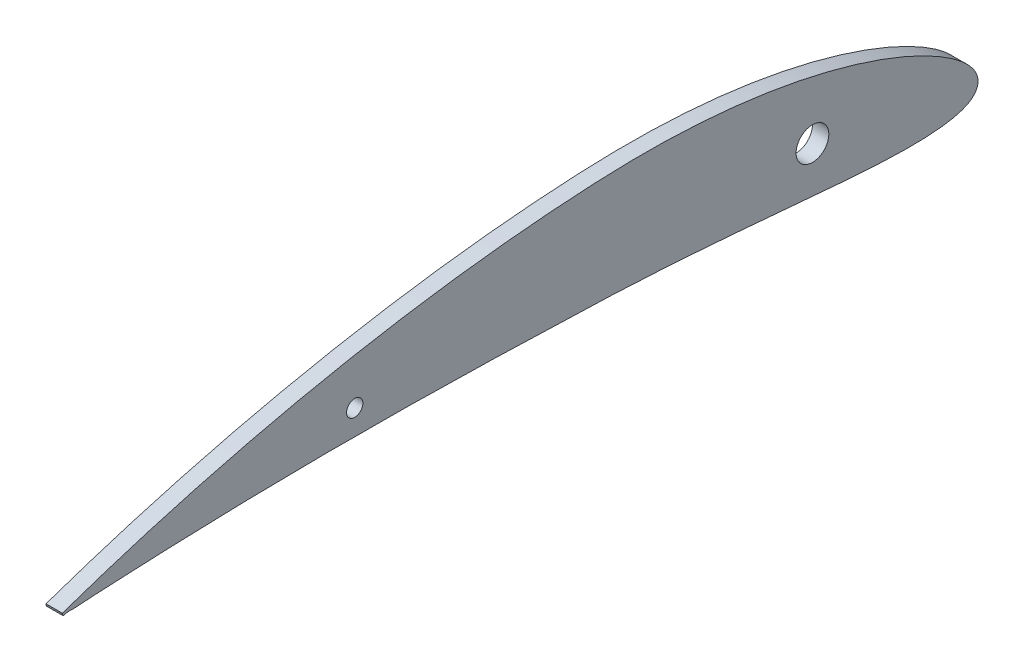
ISO-10303-21;
HEADER;
FILE_DESCRIPTION(('STEP AP214'),'2;1');
FILE_NAME('part.step','',(''),(''),'','','');
FILE_SCHEMA(('AUTOMOTIVE_DESIGN { 1 0 10303 214 1 1 1 1 }'));
ENDSEC;
DATA;
#1=APPLICATION_CONTEXT('core data for automotive mechanical design processes');
#2=APPLICATION_PROTOCOL_DEFINITION('international standard','automotive_design',2000,#1);
#3=PRODUCT_CONTEXT('',#1,'mechanical');
#4=PRODUCT('Part','Part','',(#3));
#5=PRODUCT_RELATED_PRODUCT_CATEGORY('part','',(#4));
#6=PRODUCT_DEFINITION_FORMATION('','',#4);
#7=PRODUCT_DEFINITION_CONTEXT('part definition',#1,'design');
#8=PRODUCT_DEFINITION('design','',#6,#7);
#9=PRODUCT_DEFINITION_SHAPE('','',#8);
#10=(LENGTH_UNIT() NAMED_UNIT(*) SI_UNIT(.MILLI.,.METRE.));
#11=(NAMED_UNIT(*) PLANE_ANGLE_UNIT() SI_UNIT($,.RADIAN.));
#12=(NAMED_UNIT(*) SI_UNIT($,.STERADIAN.) SOLID_ANGLE_UNIT());
#13=UNCERTAINTY_MEASURE_WITH_UNIT(LENGTH_MEASURE(1.E-05),#10,'distance_accuracy_value','');
#14=(GEOMETRIC_REPRESENTATION_CONTEXT(3) GLOBAL_UNCERTAINTY_ASSIGNED_CONTEXT((#13)) GLOBAL_UNIT_ASSIGNED_CONTEXT((#10,
#11,#12)) REPRESENTATION_CONTEXT('',''));
#15=CARTESIAN_POINT('',(0.,0.,0.));
#16=DIRECTION('',(0.,0.,1.));
#17=DIRECTION('',(1.,0.,0.));
#18=AXIS2_PLACEMENT_3D('',#15,#16,#17);
#19=CARTESIAN_POINT('',(-3.175,-0.0302571964763549,354.787327227915));
#20=CARTESIAN_POINT('',(-3.175,-0.202511549774369,354.777220058735));
#21=CARTESIAN_POINT('',(-3.175,-0.758116619532224,354.744619463571));
#22=CARTESIAN_POINT('',(-3.175,-0.0353878265544988,352.780150329408));
#23=CARTESIAN_POINT('',(-3.175,-0.406394891328532,350.227621537646));
#24=CARTESIAN_POINT('',(-3.175,0.191518705423128,345.076973542852));
#25=CARTESIAN_POINT('',(-3.175,0.426846954997304,338.388880463138));
#26=CARTESIAN_POINT('',(-3.175,0.912902226587254,329.767358245601));
#27=CARTESIAN_POINT('',(-3.175,1.37107480853054,319.513378005819));
#28=CARTESIAN_POINT('',(-3.175,1.85212662662604,307.681856469284));
#29=CARTESIAN_POINT('',(-3.175,2.2828903737653,294.437996631764));
#30=CARTESIAN_POINT('',(-3.175,2.65636592644588,279.933149694368));
#31=CARTESIAN_POINT('',(-3.175,2.90744759821903,264.337268620967));
#32=CARTESIAN_POINT('',(-3.175,3.02848065946825,247.830237404837));
#33=CARTESIAN_POINT('',(-3.175,2.97910623211237,224.541124113717));
#34=CARTESIAN_POINT('',(-3.175,2.58624656268472,200.671973719441));
#35=CARTESIAN_POINT('',(-3.175,1.91789319340299,176.483884619505));
#36=CARTESIAN_POINT('',(-3.175,1.28674404323604,158.296467958687));
#37=CARTESIAN_POINT('',(-3.175,0.674535202653767,140.48477689744));
#38=CARTESIAN_POINT('',(-3.175,-0.458414507964394,117.937239158073));
#39=CARTESIAN_POINT('',(-3.175,-2.15355585803942,96.4067365521407));
#40=CARTESIAN_POINT('',(-3.175,-3.98391169785236,75.9298626432168));
#41=CARTESIAN_POINT('',(-3.175,-5.23803481691952,61.9523939500743));
#42=CARTESIAN_POINT('',(-3.175,-6.3018667845873,49.0830780174977));
#43=CARTESIAN_POINT('',(-3.175,-7.05379709208437,37.4470572233417));
#44=CARTESIAN_POINT('',(-3.175,-7.40487495085787,27.1638266260831));
#45=CARTESIAN_POINT('',(-3.175,-7.26852765592077,18.3491197902741));
#46=CARTESIAN_POINT('',(-3.175,-6.58746462442697,11.0873159681167));
#47=CARTESIAN_POINT('',(-3.175,-5.28808573883758,5.4507808849597));
#48=CARTESIAN_POINT('',(-3.175,-3.30894318563573,1.35108725963543));
#49=CARTESIAN_POINT('',(-3.175,-0.148325215865237,-0.987487677240321));
#50=CARTESIAN_POINT('',(-3.175,3.7967578133831,-0.765838064798878));
#51=CARTESIAN_POINT('',(-3.175,7.71649979382027,1.67922407257184));
#52=CARTESIAN_POINT('',(-3.175,11.8553419578337,5.92689766090299));
#53=CARTESIAN_POINT('',(-3.175,16.2262899348965,12.1072031542234));
#54=CARTESIAN_POINT('',(-3.175,20.7343193498453,20.187014187513));
#55=CARTESIAN_POINT('',(-3.175,25.2201252971746,30.130463623116));
#56=CARTESIAN_POINT('',(-3.175,29.5108543834638,41.8433907768923));
#57=CARTESIAN_POINT('',(-3.175,33.4329059974258,55.1997604360673));
#58=CARTESIAN_POINT('',(-3.175,36.8104805743368,70.0434509571498));
#59=CARTESIAN_POINT('',(-3.175,39.4786761807971,86.1884085277303));
#60=CARTESIAN_POINT('',(-3.175,41.32105063238,103.42216726238));
#61=CARTESIAN_POINT('',(-3.175,42.2288581946823,121.516747473044));
#62=CARTESIAN_POINT('',(-3.175,42.1113766684293,140.09669102153));
#63=CARTESIAN_POINT('',(-3.175,41.1132128906756,158.902335219002));
#64=CARTESIAN_POINT('',(-3.175,39.0904540579609,183.961657870227));
#65=CARTESIAN_POINT('',(-3.175,36.0047557168601,208.774809212926));
#66=CARTESIAN_POINT('',(-3.175,31.1455287976255,238.622276389231));
#67=CARTESIAN_POINT('',(-3.175,26.6515697314507,261.175777938493));
#68=CARTESIAN_POINT('',(-3.175,21.7242725259394,282.422876263721));
#69=CARTESIAN_POINT('',(-3.175,17.1306006385399,300.598349456261));
#70=CARTESIAN_POINT('',(-3.175,11.7988919274353,319.654473711953));
#71=CARTESIAN_POINT('',(-3.175,6.72155114802005,336.024074691811));
#72=CARTESIAN_POINT('',(-3.175,3.49779827393597,345.800950265157));
#73=CARTESIAN_POINT('',(-3.175,1.92709586834348,350.478726649503));
#74=CARTESIAN_POINT('',(-3.175,0.953557869568799,353.29965963041));
#75=CARTESIAN_POINT('',(-3.175,0.519388000117919,354.559877308969));
#76=CARTESIAN_POINT('',(-3.175,0.410417886541196,354.876173010782));
#77=B_SPLINE_CURVE_WITH_KNOTS('',3,(#19,#20,#21,#22,#23,#24,#25,#26,#27,#28,#29,#30,#31,#32,#33,
#34,#35,#36,#37,#38,#39,#40,#41,#42,#43,#44,#45,#46,#47,#48,#49,#50,#51,#52,#53,#54,#55,#56,#57,
#58,#59,#60,#61,#62,#63,#64,#65,#66,#67,#68,#69,#70,#71,#72,#73,#74,#75,#76),.UNSPECIFIED.,.F.,
.F.,(4,1,1,1,1,1,1,1,1,1,1,1,1,1,1,1,1,1,1,1,1,1,1,1,1,1,1,1,1,1,1,1,1,1,1,1,1,1,1,1,1,1,1,1,1,
1,1,1,1,1,1,1,1,1,1,4),(0.,0.00061435602735338,0.00198160056276364,0.00606849911990259,
0.0128259983002053,0.0221600600259541,0.0339528411484215,0.0480573219049674,0.0643016527838605,
0.0824806064748046,0.102390013464696,0.123786894847983,0.146429707819126,0.170067604158041,
0.219268231220122,0.244299756437978,0.269272617042279,0.293879334559277,0.317367886846568,
0.361825599196296,0.382415541627446,0.401655123624231,0.419361860817184,0.435356743556399,
0.44945739068769,0.461534248286615,0.471483960270294,0.479298491667603,0.485175806315722,
0.489815015537041,0.49445371882196,0.500384211459872,0.508369297965653,0.518670584727767,
0.531320006060474,0.54625561026072,0.563345994084458,0.58242326585592,0.60328874622392,
0.625720296766354,0.649474912467889,0.674310012117921,0.699958821683972,0.725614899189679,
0.751503233324799,0.803021620411888,0.828087427427487,0.875472920842336,0.897280851310736,
0.917503738861992,0.952328750245583,0.978398030734231,0.987765198149775,0.994535224157492,
0.998628423374974,1.),.UNSPECIFIED.);
#78=DIRECTION('',(1.,0.,0.));
#79=VECTOR('',#78,1.);
#80=SURFACE_OF_LINEAR_EXTRUSION('',#77,#79);
#81=DIRECTION('',(1.,0.,0.));
#82=VECTOR('',#81,1.);
#83=CARTESIAN_POINT('',(-3.175,0.410417886541196,354.876173010782));
#84=LINE('',#83,#82);
#85=CARTESIAN_POINT('',(-3.175,0.410417886541196,354.876173010782));
#86=VERTEX_POINT('',#85);
#87=CARTESIAN_POINT('',(3.175,0.410417886541196,354.876173010782));
#88=VERTEX_POINT('',#87);
#89=EDGE_CURVE('E44',#86,#88,#84,.T.);
#90=ORIENTED_EDGE('',*,*,#89,.T.);
#91=CARTESIAN_POINT('',(3.175,-0.0302571964763549,354.787327227915));
#92=CARTESIAN_POINT('',(3.175,-0.202511549774369,354.777220058735));
#93=CARTESIAN_POINT('',(3.175,-0.758116619532224,354.744619463571));
#94=CARTESIAN_POINT('',(3.175,-0.0353878265544988,352.780150329408));
#95=CARTESIAN_POINT('',(3.175,-0.406394891328532,350.227621537646));
#96=CARTESIAN_POINT('',(3.175,0.191518705423128,345.076973542852));
#97=CARTESIAN_POINT('',(3.175,0.426846954997304,338.388880463138));
#98=CARTESIAN_POINT('',(3.175,0.912902226587254,329.767358245601));
#99=CARTESIAN_POINT('',(3.175,1.37107480853054,319.513378005819));
#100=CARTESIAN_POINT('',(3.175,1.85212662662604,307.681856469284));
#101=CARTESIAN_POINT('',(3.175,2.2828903737653,294.437996631764));
#102=CARTESIAN_POINT('',(3.175,2.65636592644588,279.933149694368));
#103=CARTESIAN_POINT('',(3.175,2.90744759821903,264.337268620967));
#104=CARTESIAN_POINT('',(3.175,3.02848065946825,247.830237404837));
#105=CARTESIAN_POINT('',(3.175,2.97910623211237,224.541124113717));
#106=CARTESIAN_POINT('',(3.175,2.58624656268472,200.671973719441));
#107=CARTESIAN_POINT('',(3.175,1.91789319340299,176.483884619505));
#108=CARTESIAN_POINT('',(3.175,1.28674404323604,158.296467958687));
#109=CARTESIAN_POINT('',(3.175,0.674535202653767,140.48477689744));
#110=CARTESIAN_POINT('',(3.175,-0.458414507964394,117.937239158073));
#111=CARTESIAN_POINT('',(3.175,-2.15355585803942,96.4067365521407));
#112=CARTESIAN_POINT('',(3.175,-3.98391169785236,75.9298626432168));
#113=CARTESIAN_POINT('',(3.175,-5.23803481691952,61.9523939500743));
#114=CARTESIAN_POINT('',(3.175,-6.3018667845873,49.0830780174977));
#115=CARTESIAN_POINT('',(3.175,-7.05379709208437,37.4470572233417));
#116=CARTESIAN_POINT('',(3.175,-7.40487495085787,27.1638266260831));
#117=CARTESIAN_POINT('',(3.175,-7.26852765592077,18.3491197902741));
#118=CARTESIAN_POINT('',(3.175,-6.58746462442697,11.0873159681167));
#119=CARTESIAN_POINT('',(3.175,-5.28808573883758,5.4507808849597));
#120=CARTESIAN_POINT('',(3.175,-3.30894318563573,1.35108725963543));
#121=CARTESIAN_POINT('',(3.175,-0.148325215865237,-0.987487677240321));
#122=CARTESIAN_POINT('',(3.175,3.7967578133831,-0.765838064798878));
#123=CARTESIAN_POINT('',(3.175,7.71649979382027,1.67922407257184));
#124=CARTESIAN_POINT('',(3.175,11.8553419578337,5.92689766090299));
#125=CARTESIAN_POINT('',(3.175,16.2262899348965,12.1072031542234));
#126=CARTESIAN_POINT('',(3.175,20.7343193498453,20.187014187513));
#127=CARTESIAN_POINT('',(3.175,25.2201252971746,30.130463623116));
#128=CARTESIAN_POINT('',(3.175,29.5108543834638,41.8433907768923));
#129=CARTESIAN_POINT('',(3.175,33.4329059974258,55.1997604360673));
#130=CARTESIAN_POINT('',(3.175,36.8104805743368,70.0434509571498));
#131=CARTESIAN_POINT('',(3.175,39.4786761807971,86.1884085277303));
#132=CARTESIAN_POINT('',(3.175,41.32105063238,103.42216726238));
#133=CARTESIAN_POINT('',(3.175,42.2288581946823,121.516747473044));
#134=CARTESIAN_POINT('',(3.175,42.1113766684293,140.09669102153));
#135=CARTESIAN_POINT('',(3.175,41.1132128906756,158.902335219002));
#136=CARTESIAN_POINT('',(3.175,39.0904540579609,183.961657870227));
#137=CARTESIAN_POINT('',(3.175,36.0047557168601,208.774809212926));
#138=CARTESIAN_POINT('',(3.175,31.1455287976255,238.622276389231));
#139=CARTESIAN_POINT('',(3.175,26.6515697314507,261.175777938493));
#140=CARTESIAN_POINT('',(3.175,21.7242725259394,282.422876263721));
#141=CARTESIAN_POINT('',(3.175,17.1306006385399,300.598349456261));
#142=CARTESIAN_POINT('',(3.175,11.7988919274353,319.654473711953));
#143=CARTESIAN_POINT('',(3.175,6.72155114802005,336.024074691811));
#144=CARTESIAN_POINT('',(3.175,3.49779827393597,345.800950265157));
#145=CARTESIAN_POINT('',(3.175,1.92709586834348,350.478726649503));
#146=CARTESIAN_POINT('',(3.175,0.953557869568799,353.29965963041));
#147=CARTESIAN_POINT('',(3.175,0.519388000117919,354.559877308969));
#148=CARTESIAN_POINT('',(3.175,0.410417886541196,354.876173010782));
#149=B_SPLINE_CURVE_WITH_KNOTS('',3,(#91,#92,#93,#94,#95,#96,#97,#98,#99,#100,#101,#102,#103,
#104,#105,#106,#107,#108,#109,#110,#111,#112,#113,#114,#115,#116,#117,#118,#119,#120,#121,#122,
#123,#124,#125,#126,#127,#128,#129,#130,#131,#132,#133,#134,#135,#136,#137,#138,#139,#140,#141,
#142,#143,#144,#145,#146,#147,#148),.UNSPECIFIED.,.F.,.F.,(4,1,1,1,1,1,1,1,1,1,1,1,1,1,1,1,1,1,
1,1,1,1,1,1,1,1,1,1,1,1,1,1,1,1,1,1,1,1,1,1,1,1,1,1,1,1,1,1,1,1,1,1,1,1,1,4),(0.,
0.00061435602735338,0.00198160056276364,0.00606849911990259,0.0128259983002053,
0.0221600600259541,0.0339528411484215,0.0480573219049674,0.0643016527838605,0.0824806064748046,
0.102390013464696,0.123786894847983,0.146429707819126,0.170067604158041,0.219268231220122,
0.244299756437978,0.269272617042279,0.293879334559277,0.317367886846568,0.361825599196296,
0.382415541627446,0.401655123624231,0.419361860817184,0.435356743556399,0.44945739068769,
0.461534248286615,0.471483960270294,0.479298491667603,0.485175806315722,0.489815015537041,
0.49445371882196,0.500384211459872,0.508369297965653,0.518670584727767,0.531320006060474,
0.54625561026072,0.563345994084458,0.58242326585592,0.60328874622392,0.625720296766354,
0.649474912467889,0.674310012117921,0.699958821683972,0.725614899189679,0.751503233324799,
0.803021620411888,0.828087427427487,0.875472920842336,0.897280851310736,0.917503738861992,
0.952328750245583,0.978398030734231,0.987765198149775,0.994535224157492,0.998628423374974,1.),.UNSPECIFIED.);
#150=CARTESIAN_POINT('',(3.175,-0.030257196476355,354.787327227915));
#151=VERTEX_POINT('',#150);
#152=EDGE_CURVE('E66',#151,#88,#149,.T.);
#153=ORIENTED_EDGE('',*,*,#152,.F.);
#154=DIRECTION('',(1.,0.,0.));
#155=VECTOR('',#154,1.);
#156=CARTESIAN_POINT('',(-3.175,-0.030257196476355,354.787327227915));
#157=LINE('',#156,#155);
#158=CARTESIAN_POINT('',(-3.175,-0.030257196476355,354.787327227915));
#159=VERTEX_POINT('',#158);
#160=EDGE_CURVE('E11',#159,#151,#157,.T.);
#161=ORIENTED_EDGE('',*,*,#160,.F.);
#162=EDGE_CURVE('E67',#159,#86,#77,.T.);
#163=ORIENTED_EDGE('',*,*,#162,.T.);
#164=EDGE_LOOP('',(#90,#153,#161,#163));
#165=FACE_BOUND('',#164,.T.);
#166=ADVANCED_FACE('F40',(#165),#80,.T.);
#167=CARTESIAN_POINT('',(-3.175,-0.030257196476355,354.787327227915));
#168=DIRECTION('',(0.,-0.197636177726589,0.980275441523261));
#169=DIRECTION('',(0.,-0.980275441523261,-0.197636177726589));
#170=AXIS2_PLACEMENT_3D('',#167,#168,#169);
#171=PLANE('',#170);
#172=ORIENTED_EDGE('',*,*,#160,.T.);
#173=DIRECTION('',(0.,-0.980275441523261,-0.197636177726589));
#174=VECTOR('',#173,1.);
#175=CARTESIAN_POINT('',(3.175,-0.030257196476355,354.787327227915));
#176=LINE('',#175,#174);
#177=EDGE_CURVE('E72',#88,#151,#176,.T.);
#178=ORIENTED_EDGE('',*,*,#177,.F.);
#179=ORIENTED_EDGE('',*,*,#89,.F.);
#180=DIRECTION('',(0.,-0.980275441523261,-0.197636177726589));
#181=VECTOR('',#180,1.);
#182=CARTESIAN_POINT('',(-3.175,-0.030257196476355,354.787327227915));
#183=LINE('',#182,#181);
#184=EDGE_CURVE('E70',#86,#159,#183,.T.);
#185=ORIENTED_EDGE('',*,*,#184,.T.);
#186=EDGE_LOOP('',(#172,#178,#179,#185));
#187=FACE_BOUND('',#186,.T.);
#188=ADVANCED_FACE('F73',(#187),#171,.T.);
#189=CARTESIAN_POINT('',(-3.175,6.95548452892668,1.34686834904547));
#190=DIRECTION('',(-1.,0.,0.));
#191=DIRECTION('',(0.,0.,1.));
#192=AXIS2_PLACEMENT_3D('',#189,#190,#191);
#193=PLANE('',#192);
#194=CARTESIAN_POINT('',(-3.175,12.7,63.5));
#195=DIRECTION('',(-1.,0.,0.));
#196=DIRECTION('',(0.,0.,1.));
#197=AXIS2_PLACEMENT_3D('',#194,#195,#196);
#198=CIRCLE('',#197,6.35000000000001);
#199=CARTESIAN_POINT('',(-3.175,12.7,69.85));
#200=VERTEX_POINT('',#199);
#201=EDGE_CURVE('E79',#200,#200,#198,.T.);
#202=ORIENTED_EDGE('',*,*,#201,.F.);
#203=EDGE_LOOP('',(#202));
#204=FACE_BOUND('',#203,.T.);
#205=CARTESIAN_POINT('',(-3.175,12.7,241.3));
#206=DIRECTION('',(-1.,0.,0.));
#207=DIRECTION('',(0.,0.,1.));
#208=AXIS2_PLACEMENT_3D('',#205,#206,#207);
#209=CIRCLE('',#208,3.175);
#210=CARTESIAN_POINT('',(-3.175,12.7,244.475));
#211=VERTEX_POINT('',#210);
#212=EDGE_CURVE('E83',#211,#211,#209,.T.);
#213=ORIENTED_EDGE('',*,*,#212,.F.);
#214=EDGE_LOOP('',(#213));
#215=FACE_BOUND('',#214,.T.);
#216=ORIENTED_EDGE('',*,*,#162,.F.);
#217=ORIENTED_EDGE('',*,*,#184,.F.);
#218=EDGE_LOOP('',(#216,#217));
#219=FACE_BOUND('',#218,.T.);
#220=ADVANCED_FACE('F101',(#204,#215,#219),#193,.T.);
#221=CARTESIAN_POINT('',(3.175,6.95548452892668,1.34686834904547));
#222=DIRECTION('',(-1.,0.,0.));
#223=DIRECTION('',(0.,0.,1.));
#224=AXIS2_PLACEMENT_3D('',#221,#222,#223);
#225=PLANE('',#224);
#226=CARTESIAN_POINT('',(3.175,12.7,63.5));
#227=DIRECTION('',(-1.,0.,0.));
#228=DIRECTION('',(0.,0.,1.));
#229=AXIS2_PLACEMENT_3D('',#226,#227,#228);
#230=CIRCLE('',#229,6.35000000000001);
#231=CARTESIAN_POINT('',(3.175,12.7,69.85));
#232=VERTEX_POINT('',#231);
#233=EDGE_CURVE('E159',#232,#232,#230,.T.);
#234=ORIENTED_EDGE('',*,*,#233,.T.);
#235=EDGE_LOOP('',(#234));
#236=FACE_BOUND('',#235,.T.);
#237=CARTESIAN_POINT('',(3.175,12.7,241.3));
#238=DIRECTION('',(-1.,0.,0.));
#239=DIRECTION('',(0.,0.,1.));
#240=AXIS2_PLACEMENT_3D('',#237,#238,#239);
#241=CIRCLE('',#240,3.175);
#242=CARTESIAN_POINT('',(3.175,12.7,244.475));
#243=VERTEX_POINT('',#242);
#244=EDGE_CURVE('E161',#243,#243,#241,.T.);
#245=ORIENTED_EDGE('',*,*,#244,.T.);
#246=EDGE_LOOP('',(#245));
#247=FACE_BOUND('',#246,.T.);
#248=ORIENTED_EDGE('',*,*,#152,.T.);
#249=ORIENTED_EDGE('',*,*,#177,.T.);
#250=EDGE_LOOP('',(#248,#249));
#251=FACE_BOUND('',#250,.T.);
#252=ADVANCED_FACE('F77',(#236,#247,#251),#225,.F.);
#253=CARTESIAN_POINT('',(3.175,12.7,241.3));
#254=DIRECTION('',(-1.,0.,0.));
#255=DIRECTION('',(0.,0.,1.));
#256=AXIS2_PLACEMENT_3D('',#253,#254,#255);
#257=CYLINDRICAL_SURFACE('',#256,3.175);
#258=ORIENTED_EDGE('',*,*,#212,.T.);
#259=EDGE_LOOP('',(#258));
#260=FACE_BOUND('',#259,.T.);
#261=ORIENTED_EDGE('',*,*,#244,.F.);
#262=EDGE_LOOP('',(#261));
#263=FACE_BOUND('',#262,.T.);
#264=ADVANCED_FACE('F109',(#260,#263),#257,.F.);
#265=CARTESIAN_POINT('',(3.175,12.7,63.5));
#266=DIRECTION('',(-1.,0.,0.));
#267=DIRECTION('',(0.,0.,1.));
#268=AXIS2_PLACEMENT_3D('',#265,#266,#267);
#269=CYLINDRICAL_SURFACE('',#268,6.35000000000001);
#270=ORIENTED_EDGE('',*,*,#201,.T.);
#271=EDGE_LOOP('',(#270));
#272=FACE_BOUND('',#271,.T.);
#273=ORIENTED_EDGE('',*,*,#233,.F.);
#274=EDGE_LOOP('',(#273));
#275=FACE_BOUND('',#274,.T.);
#276=ADVANCED_FACE('F142',(#272,#275),#269,.F.);
#277=CLOSED_SHELL('',(#166,#188,#220,#252,#264,#276));
#278=MANIFOLD_SOLID_BREP('B2',#277);
#279=ADVANCED_BREP_SHAPE_REPRESENTATION('',(#18,#278),#14);
#280=SHAPE_DEFINITION_REPRESENTATION(#9,#279);
ENDSEC;
END-ISO-10303-21;
